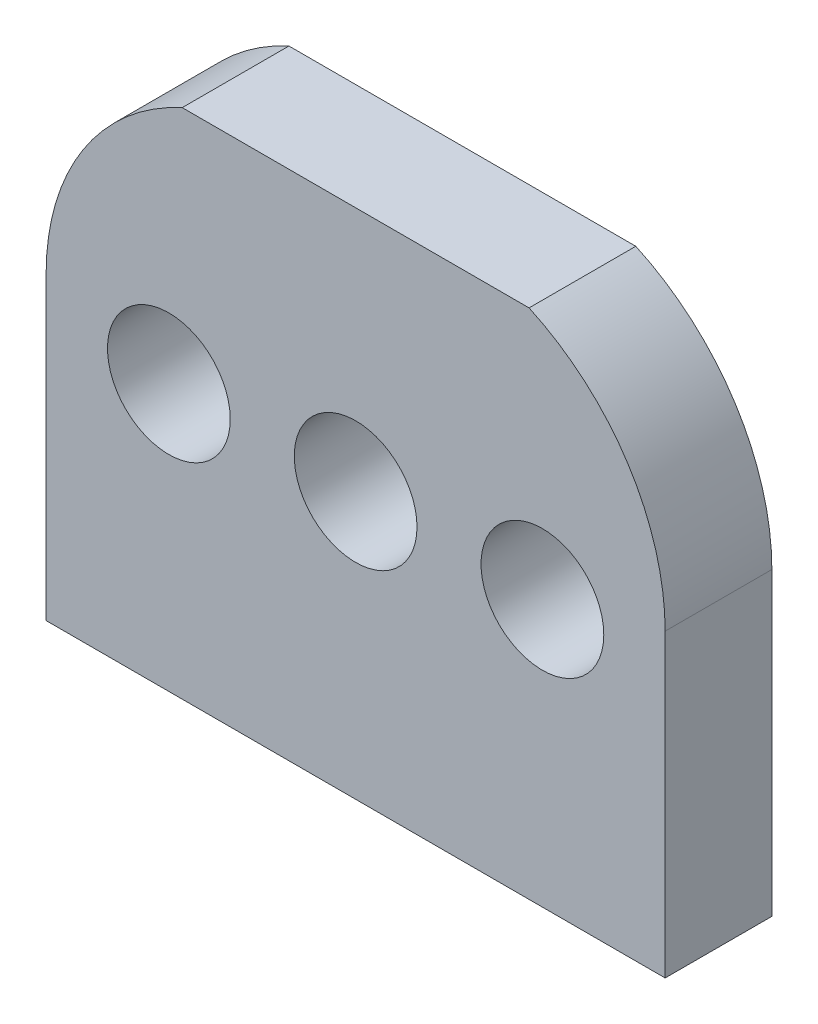
ISO-10303-21;
HEADER;
FILE_DESCRIPTION(('STEP AP214'),'2;1');
FILE_NAME('part.step','',(''),(''),'','','');
FILE_SCHEMA(('AUTOMOTIVE_DESIGN { 1 0 10303 214 1 1 1 1 }'));
ENDSEC;
DATA;
#1=APPLICATION_CONTEXT('core data for automotive mechanical design processes');
#2=APPLICATION_PROTOCOL_DEFINITION('international standard','automotive_design',2000,#1);
#3=PRODUCT_CONTEXT('',#1,'mechanical');
#4=PRODUCT('Part','Part','',(#3));
#5=PRODUCT_RELATED_PRODUCT_CATEGORY('part','',(#4));
#6=PRODUCT_DEFINITION_FORMATION('','',#4);
#7=PRODUCT_DEFINITION_CONTEXT('part definition',#1,'design');
#8=PRODUCT_DEFINITION('design','',#6,#7);
#9=PRODUCT_DEFINITION_SHAPE('','',#8);
#10=(LENGTH_UNIT() NAMED_UNIT(*) SI_UNIT(.MILLI.,.METRE.));
#11=(NAMED_UNIT(*) PLANE_ANGLE_UNIT() SI_UNIT($,.RADIAN.));
#12=(NAMED_UNIT(*) SI_UNIT($,.STERADIAN.) SOLID_ANGLE_UNIT());
#13=UNCERTAINTY_MEASURE_WITH_UNIT(LENGTH_MEASURE(1.E-05),#10,'distance_accuracy_value','');
#14=(GEOMETRIC_REPRESENTATION_CONTEXT(3) GLOBAL_UNCERTAINTY_ASSIGNED_CONTEXT((#13)) GLOBAL_UNIT_ASSIGNED_CONTEXT((#10,
#11,#12)) REPRESENTATION_CONTEXT('',''));
#15=CARTESIAN_POINT('',(0.,0.,0.));
#16=DIRECTION('',(0.,0.,1.));
#17=DIRECTION('',(1.,0.,0.));
#18=AXIS2_PLACEMENT_3D('',#15,#16,#17);
#19=CARTESIAN_POINT('',(1.43310760515362,0.63488027007446,2.));
#20=DIRECTION('',(0.,0.,1.));
#21=DIRECTION('',(1.,0.,0.));
#22=AXIS2_PLACEMENT_3D('',#19,#20,#21);
#23=PLANE('',#22);
#24=CARTESIAN_POINT('',(3.5,0.,2.));
#25=DIRECTION('',(0.,0.,1.));
#26=DIRECTION('',(1.,0.,0.));
#27=AXIS2_PLACEMENT_3D('',#24,#25,#26);
#28=CIRCLE('',#27,1.15);
#29=CARTESIAN_POINT('',(4.65,0.,2.));
#30=VERTEX_POINT('',#29);
#31=EDGE_CURVE('E185',#30,#30,#28,.T.);
#32=ORIENTED_EDGE('',*,*,#31,.F.);
#33=EDGE_LOOP('',(#32));
#34=FACE_BOUND('',#33,.T.);
#35=DIRECTION('',(0.,-1.,0.));
#36=VECTOR('',#35,1.);
#37=CARTESIAN_POINT('',(-5.8,0.63488027007446,2.));
#38=LINE('',#37,#36);
#39=CARTESIAN_POINT('',(-5.8,0.634880270074461,2.));
#40=VERTEX_POINT('',#39);
#41=CARTESIAN_POINT('',(-5.8,-4.99414362653276,2.));
#42=VERTEX_POINT('',#41);
#43=EDGE_CURVE('E130',#40,#42,#38,.T.);
#44=ORIENTED_EDGE('',*,*,#43,.T.);
#45=DIRECTION('',(1.,0.,0.));
#46=VECTOR('',#45,1.);
#47=CARTESIAN_POINT('',(-5.8,-4.99414362653276,2.));
#48=LINE('',#47,#46);
#49=CARTESIAN_POINT('',(5.8,-4.99414362653276,2.));
#50=VERTEX_POINT('',#49);
#51=EDGE_CURVE('E88',#42,#50,#48,.T.);
#52=ORIENTED_EDGE('',*,*,#51,.T.);
#53=DIRECTION('',(0.,1.,0.));
#54=VECTOR('',#53,1.);
#55=CARTESIAN_POINT('',(5.8,-4.99414362653276,2.));
#56=LINE('',#55,#54);
#57=CARTESIAN_POINT('',(5.8,0.63488027007446,2.));
#58=VERTEX_POINT('',#57);
#59=EDGE_CURVE('E101',#50,#58,#56,.T.);
#60=ORIENTED_EDGE('',*,*,#59,.T.);
#61=CARTESIAN_POINT('',(1.43310760515362,0.63488027007446,2.));
#62=DIRECTION('',(0.,0.,1.));
#63=DIRECTION('',(1.,0.,0.));
#64=AXIS2_PLACEMENT_3D('',#61,#62,#63);
#65=CIRCLE('',#64,4.36689239484638);
#66=CARTESIAN_POINT('',(3.25,4.60585637346724,2.));
#67=VERTEX_POINT('',#66);
#68=EDGE_CURVE('E95',#58,#67,#65,.T.);
#69=ORIENTED_EDGE('',*,*,#68,.T.);
#70=DIRECTION('',(-1.,0.,0.));
#71=VECTOR('',#70,1.);
#72=CARTESIAN_POINT('',(3.25,4.60585637346724,2.));
#73=LINE('',#72,#71);
#74=CARTESIAN_POINT('',(-3.25,4.60585637346724,2.));
#75=VERTEX_POINT('',#74);
#76=EDGE_CURVE('E99',#67,#75,#73,.T.);
#77=ORIENTED_EDGE('',*,*,#76,.T.);
#78=CARTESIAN_POINT('',(-1.43310760515362,0.63488027007446,2.));
#79=DIRECTION('',(0.,0.,1.));
#80=DIRECTION('',(1.,0.,0.));
#81=AXIS2_PLACEMENT_3D('',#78,#79,#80);
#82=CIRCLE('',#81,4.36689239484638);
#83=EDGE_CURVE('E51',#75,#40,#82,.T.);
#84=ORIENTED_EDGE('',*,*,#83,.T.);
#85=EDGE_LOOP('',(#44,#52,#60,#69,#77,#84));
#86=FACE_BOUND('',#85,.T.);
#87=CARTESIAN_POINT('',(0.,0.,2.));
#88=DIRECTION('',(0.,0.,1.));
#89=DIRECTION('',(1.,0.,0.));
#90=AXIS2_PLACEMENT_3D('',#87,#88,#89);
#91=CIRCLE('',#90,1.15);
#92=CARTESIAN_POINT('',(1.15,0.,2.));
#93=VERTEX_POINT('',#92);
#94=EDGE_CURVE('E123',#93,#93,#91,.T.);
#95=ORIENTED_EDGE('',*,*,#94,.F.);
#96=EDGE_LOOP('',(#95));
#97=FACE_BOUND('',#96,.T.);
#98=CARTESIAN_POINT('',(-3.5,0.,2.));
#99=DIRECTION('',(0.,0.,1.));
#100=DIRECTION('',(1.,0.,0.));
#101=AXIS2_PLACEMENT_3D('',#98,#99,#100);
#102=CIRCLE('',#101,1.15);
#103=CARTESIAN_POINT('',(-2.35,0.,2.));
#104=VERTEX_POINT('',#103);
#105=EDGE_CURVE('E176',#104,#104,#102,.T.);
#106=ORIENTED_EDGE('',*,*,#105,.F.);
#107=EDGE_LOOP('',(#106));
#108=FACE_BOUND('',#107,.T.);
#109=ADVANCED_FACE('F34',(#34,#86,#97,#108),#23,.T.);
#110=CARTESIAN_POINT('',(1.43310760515362,0.63488027007446,0.));
#111=DIRECTION('',(0.,0.,1.));
#112=DIRECTION('',(1.,0.,0.));
#113=AXIS2_PLACEMENT_3D('',#110,#111,#112);
#114=PLANE('',#113);
#115=DIRECTION('',(0.,-1.,0.));
#116=VECTOR('',#115,1.);
#117=CARTESIAN_POINT('',(-5.8,0.63488027007446,0.));
#118=LINE('',#117,#116);
#119=CARTESIAN_POINT('',(-5.8,0.634880270074461,0.));
#120=VERTEX_POINT('',#119);
#121=CARTESIAN_POINT('',(-5.8,-4.99414362653276,0.));
#122=VERTEX_POINT('',#121);
#123=EDGE_CURVE('E119',#120,#122,#118,.T.);
#124=ORIENTED_EDGE('',*,*,#123,.F.);
#125=CARTESIAN_POINT('',(-1.43310760515362,0.63488027007446,0.));
#126=DIRECTION('',(0.,0.,1.));
#127=DIRECTION('',(1.,0.,0.));
#128=AXIS2_PLACEMENT_3D('',#125,#126,#127);
#129=CIRCLE('',#128,4.36689239484638);
#130=CARTESIAN_POINT('',(-3.25,4.60585637346724,0.));
#131=VERTEX_POINT('',#130);
#132=EDGE_CURVE('E80',#131,#120,#129,.T.);
#133=ORIENTED_EDGE('',*,*,#132,.F.);
#134=DIRECTION('',(-1.,0.,0.));
#135=VECTOR('',#134,1.);
#136=CARTESIAN_POINT('',(3.25,4.60585637346724,0.));
#137=LINE('',#136,#135);
#138=CARTESIAN_POINT('',(3.25,4.60585637346724,0.));
#139=VERTEX_POINT('',#138);
#140=EDGE_CURVE('E74',#139,#131,#137,.T.);
#141=ORIENTED_EDGE('',*,*,#140,.F.);
#142=CARTESIAN_POINT('',(1.43310760515362,0.63488027007446,0.));
#143=DIRECTION('',(0.,0.,1.));
#144=DIRECTION('',(1.,0.,0.));
#145=AXIS2_PLACEMENT_3D('',#142,#143,#144);
#146=CIRCLE('',#145,4.36689239484638);
#147=CARTESIAN_POINT('',(5.8,0.63488027007446,0.));
#148=VERTEX_POINT('',#147);
#149=EDGE_CURVE('E109',#148,#139,#146,.T.);
#150=ORIENTED_EDGE('',*,*,#149,.F.);
#151=DIRECTION('',(0.,1.,0.));
#152=VECTOR('',#151,1.);
#153=CARTESIAN_POINT('',(5.8,-4.99414362653276,0.));
#154=LINE('',#153,#152);
#155=CARTESIAN_POINT('',(5.8,-4.99414362653276,0.));
#156=VERTEX_POINT('',#155);
#157=EDGE_CURVE('E125',#156,#148,#154,.T.);
#158=ORIENTED_EDGE('',*,*,#157,.F.);
#159=DIRECTION('',(1.,0.,0.));
#160=VECTOR('',#159,1.);
#161=CARTESIAN_POINT('',(-5.8,-4.99414362653276,0.));
#162=LINE('',#161,#160);
#163=EDGE_CURVE('E122',#122,#156,#162,.T.);
#164=ORIENTED_EDGE('',*,*,#163,.F.);
#165=EDGE_LOOP('',(#124,#133,#141,#150,#158,#164));
#166=FACE_BOUND('',#165,.T.);
#167=CARTESIAN_POINT('',(0.,0.,0.));
#168=DIRECTION('',(0.,0.,1.));
#169=DIRECTION('',(1.,0.,0.));
#170=AXIS2_PLACEMENT_3D('',#167,#168,#169);
#171=CIRCLE('',#170,1.15);
#172=CARTESIAN_POINT('',(1.15,0.,0.));
#173=VERTEX_POINT('',#172);
#174=EDGE_CURVE('E188',#173,#173,#171,.T.);
#175=ORIENTED_EDGE('',*,*,#174,.T.);
#176=EDGE_LOOP('',(#175));
#177=FACE_BOUND('',#176,.T.);
#178=CARTESIAN_POINT('',(3.5,0.,0.));
#179=DIRECTION('',(0.,0.,1.));
#180=DIRECTION('',(1.,0.,0.));
#181=AXIS2_PLACEMENT_3D('',#178,#179,#180);
#182=CIRCLE('',#181,1.15);
#183=CARTESIAN_POINT('',(4.65,0.,0.));
#184=VERTEX_POINT('',#183);
#185=EDGE_CURVE('E182',#184,#184,#182,.T.);
#186=ORIENTED_EDGE('',*,*,#185,.T.);
#187=EDGE_LOOP('',(#186));
#188=FACE_BOUND('',#187,.T.);
#189=CARTESIAN_POINT('',(-3.5,0.,0.));
#190=DIRECTION('',(0.,0.,1.));
#191=DIRECTION('',(1.,0.,0.));
#192=AXIS2_PLACEMENT_3D('',#189,#190,#191);
#193=CIRCLE('',#192,1.15);
#194=CARTESIAN_POINT('',(-2.35,0.,0.));
#195=VERTEX_POINT('',#194);
#196=EDGE_CURVE('E179',#195,#195,#193,.T.);
#197=ORIENTED_EDGE('',*,*,#196,.T.);
#198=EDGE_LOOP('',(#197));
#199=FACE_BOUND('',#198,.T.);
#200=ADVANCED_FACE('F139',(#166,#177,#188,#199),#114,.F.);
#201=CARTESIAN_POINT('',(-5.8,0.63488027007446,2.));
#202=DIRECTION('',(1.,0.,0.));
#203=DIRECTION('',(0.,0.,-1.));
#204=AXIS2_PLACEMENT_3D('',#201,#202,#203);
#205=PLANE('',#204);
#206=ORIENTED_EDGE('',*,*,#123,.T.);
#207=DIRECTION('',(0.,0.,-1.));
#208=VECTOR('',#207,1.);
#209=CARTESIAN_POINT('',(-5.8,-4.99414362653276,2.));
#210=LINE('',#209,#208);
#211=EDGE_CURVE('E11',#42,#122,#210,.T.);
#212=ORIENTED_EDGE('',*,*,#211,.F.);
#213=ORIENTED_EDGE('',*,*,#43,.F.);
#214=DIRECTION('',(0.,0.,-1.));
#215=VECTOR('',#214,1.);
#216=CARTESIAN_POINT('',(-5.8,0.634880270074461,2.));
#217=LINE('',#216,#215);
#218=EDGE_CURVE('E115',#40,#120,#217,.T.);
#219=ORIENTED_EDGE('',*,*,#218,.T.);
#220=EDGE_LOOP('',(#206,#212,#213,#219));
#221=FACE_BOUND('',#220,.T.);
#222=ADVANCED_FACE('F36',(#221),#205,.F.);
#223=CARTESIAN_POINT('',(-5.8,-4.99414362653276,2.));
#224=DIRECTION('',(0.,1.,0.));
#225=DIRECTION('',(0.,0.,1.));
#226=AXIS2_PLACEMENT_3D('',#223,#224,#225);
#227=PLANE('',#226);
#228=ORIENTED_EDGE('',*,*,#163,.T.);
#229=DIRECTION('',(0.,0.,-1.));
#230=VECTOR('',#229,1.);
#231=CARTESIAN_POINT('',(5.8,-4.99414362653276,2.));
#232=LINE('',#231,#230);
#233=EDGE_CURVE('E43',#50,#156,#232,.T.);
#234=ORIENTED_EDGE('',*,*,#233,.F.);
#235=ORIENTED_EDGE('',*,*,#51,.F.);
#236=ORIENTED_EDGE('',*,*,#211,.T.);
#237=EDGE_LOOP('',(#228,#234,#235,#236));
#238=FACE_BOUND('',#237,.T.);
#239=ADVANCED_FACE('F221',(#238),#227,.F.);
#240=CARTESIAN_POINT('',(5.8,-4.99414362653276,2.));
#241=DIRECTION('',(-1.,0.,0.));
#242=DIRECTION('',(0.,0.,1.));
#243=AXIS2_PLACEMENT_3D('',#240,#241,#242);
#244=PLANE('',#243);
#245=ORIENTED_EDGE('',*,*,#157,.T.);
#246=DIRECTION('',(0.,0.,-1.));
#247=VECTOR('',#246,1.);
#248=CARTESIAN_POINT('',(5.8,0.63488027007446,2.));
#249=LINE('',#248,#247);
#250=EDGE_CURVE('E110',#58,#148,#249,.T.);
#251=ORIENTED_EDGE('',*,*,#250,.F.);
#252=ORIENTED_EDGE('',*,*,#59,.F.);
#253=ORIENTED_EDGE('',*,*,#233,.T.);
#254=EDGE_LOOP('',(#245,#251,#252,#253));
#255=FACE_BOUND('',#254,.T.);
#256=ADVANCED_FACE('F136',(#255),#244,.F.);
#257=CARTESIAN_POINT('',(1.43310760515362,0.63488027007446,2.));
#258=DIRECTION('',(0.,0.,-1.));
#259=DIRECTION('',(-1.,0.,0.));
#260=AXIS2_PLACEMENT_3D('',#257,#258,#259);
#261=CYLINDRICAL_SURFACE('',#260,4.36689239484638);
#262=ORIENTED_EDGE('',*,*,#149,.T.);
#263=DIRECTION('',(0.,0.,-1.));
#264=VECTOR('',#263,1.);
#265=CARTESIAN_POINT('',(3.25,4.60585637346724,2.));
#266=LINE('',#265,#264);
#267=EDGE_CURVE('E106',#67,#139,#266,.T.);
#268=ORIENTED_EDGE('',*,*,#267,.F.);
#269=ORIENTED_EDGE('',*,*,#68,.F.);
#270=ORIENTED_EDGE('',*,*,#250,.T.);
#271=EDGE_LOOP('',(#262,#268,#269,#270));
#272=FACE_BOUND('',#271,.T.);
#273=ADVANCED_FACE('F107',(#272),#261,.T.);
#274=CARTESIAN_POINT('',(3.25,4.60585637346724,2.));
#275=DIRECTION('',(0.,-1.,0.));
#276=DIRECTION('',(0.,0.,-1.));
#277=AXIS2_PLACEMENT_3D('',#274,#275,#276);
#278=PLANE('',#277);
#279=ORIENTED_EDGE('',*,*,#140,.T.);
#280=DIRECTION('',(0.,0.,-1.));
#281=VECTOR('',#280,1.);
#282=CARTESIAN_POINT('',(-3.25,4.60585637346724,2.));
#283=LINE('',#282,#281);
#284=EDGE_CURVE('E111',#75,#131,#283,.T.);
#285=ORIENTED_EDGE('',*,*,#284,.F.);
#286=ORIENTED_EDGE('',*,*,#76,.F.);
#287=ORIENTED_EDGE('',*,*,#267,.T.);
#288=EDGE_LOOP('',(#279,#285,#286,#287));
#289=FACE_BOUND('',#288,.T.);
#290=ADVANCED_FACE('F113',(#289),#278,.F.);
#291=CARTESIAN_POINT('',(-1.43310760515362,0.63488027007446,2.));
#292=DIRECTION('',(0.,0.,-1.));
#293=DIRECTION('',(-1.,0.,0.));
#294=AXIS2_PLACEMENT_3D('',#291,#292,#293);
#295=CYLINDRICAL_SURFACE('',#294,4.36689239484638);
#296=ORIENTED_EDGE('',*,*,#132,.T.);
#297=ORIENTED_EDGE('',*,*,#218,.F.);
#298=ORIENTED_EDGE('',*,*,#83,.F.);
#299=ORIENTED_EDGE('',*,*,#284,.T.);
#300=EDGE_LOOP('',(#296,#297,#298,#299));
#301=FACE_BOUND('',#300,.T.);
#302=ADVANCED_FACE('F144',(#301),#295,.T.);
#303=CARTESIAN_POINT('',(0.,0.,2.));
#304=DIRECTION('',(0.,0.,-1.));
#305=DIRECTION('',(-1.,0.,0.));
#306=AXIS2_PLACEMENT_3D('',#303,#304,#305);
#307=CYLINDRICAL_SURFACE('',#306,1.15);
#308=ORIENTED_EDGE('',*,*,#94,.T.);
#309=EDGE_LOOP('',(#308));
#310=FACE_BOUND('',#309,.T.);
#311=ORIENTED_EDGE('',*,*,#174,.F.);
#312=EDGE_LOOP('',(#311));
#313=FACE_BOUND('',#312,.T.);
#314=ADVANCED_FACE('F146',(#310,#313),#307,.F.);
#315=CARTESIAN_POINT('',(3.5,0.,2.));
#316=DIRECTION('',(0.,0.,-1.));
#317=DIRECTION('',(-1.,0.,0.));
#318=AXIS2_PLACEMENT_3D('',#315,#316,#317);
#319=CYLINDRICAL_SURFACE('',#318,1.15);
#320=ORIENTED_EDGE('',*,*,#31,.T.);
#321=EDGE_LOOP('',(#320));
#322=FACE_BOUND('',#321,.T.);
#323=ORIENTED_EDGE('',*,*,#185,.F.);
#324=EDGE_LOOP('',(#323));
#325=FACE_BOUND('',#324,.T.);
#326=ADVANCED_FACE('F152',(#322,#325),#319,.F.);
#327=CARTESIAN_POINT('',(-3.5,0.,2.));
#328=DIRECTION('',(0.,0.,-1.));
#329=DIRECTION('',(-1.,0.,0.));
#330=AXIS2_PLACEMENT_3D('',#327,#328,#329);
#331=CYLINDRICAL_SURFACE('',#330,1.15);
#332=ORIENTED_EDGE('',*,*,#105,.T.);
#333=EDGE_LOOP('',(#332));
#334=FACE_BOUND('',#333,.T.);
#335=ORIENTED_EDGE('',*,*,#196,.F.);
#336=EDGE_LOOP('',(#335));
#337=FACE_BOUND('',#336,.T.);
#338=ADVANCED_FACE('F167',(#334,#337),#331,.F.);
#339=CLOSED_SHELL('',(#109,#200,#222,#239,#256,#273,#290,#302,#314,#326,#338));
#340=MANIFOLD_SOLID_BREP('B2',#339);
#341=ADVANCED_BREP_SHAPE_REPRESENTATION('',(#18,#340),#14);
#342=SHAPE_DEFINITION_REPRESENTATION(#9,#341);
ENDSEC;
END-ISO-10303-21;
